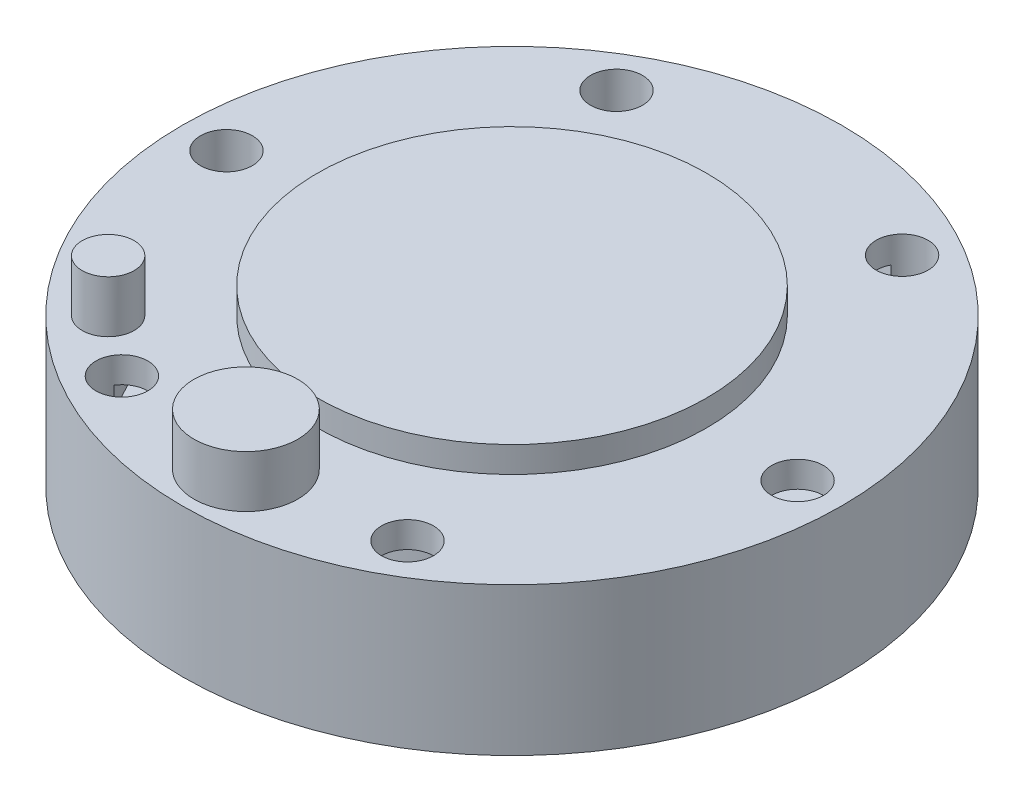
ISO-10303-21;
HEADER;
FILE_DESCRIPTION(('STEP AP214'),'2;1');
FILE_NAME('part.step','',(''),(''),'','','');
FILE_SCHEMA(('AUTOMOTIVE_DESIGN { 1 0 10303 214 1 1 1 1 }'));
ENDSEC;
DATA;
#1=APPLICATION_CONTEXT('core data for automotive mechanical design processes');
#2=APPLICATION_PROTOCOL_DEFINITION('international standard','automotive_design',2000,#1);
#3=PRODUCT_CONTEXT('',#1,'mechanical');
#4=PRODUCT('Part','Part','',(#3));
#5=PRODUCT_RELATED_PRODUCT_CATEGORY('part','',(#4));
#6=PRODUCT_DEFINITION_FORMATION('','',#4);
#7=PRODUCT_DEFINITION_CONTEXT('part definition',#1,'design');
#8=PRODUCT_DEFINITION('design','',#6,#7);
#9=PRODUCT_DEFINITION_SHAPE('','',#8);
#10=(LENGTH_UNIT() NAMED_UNIT(*) SI_UNIT(.MILLI.,.METRE.));
#11=(NAMED_UNIT(*) PLANE_ANGLE_UNIT() SI_UNIT($,.RADIAN.));
#12=(NAMED_UNIT(*) SI_UNIT($,.STERADIAN.) SOLID_ANGLE_UNIT());
#13=UNCERTAINTY_MEASURE_WITH_UNIT(LENGTH_MEASURE(1.E-05),#10,'distance_accuracy_value','');
#14=(GEOMETRIC_REPRESENTATION_CONTEXT(3) GLOBAL_UNCERTAINTY_ASSIGNED_CONTEXT((#13)) GLOBAL_UNIT_ASSIGNED_CONTEXT((#10,
#11,#12)) REPRESENTATION_CONTEXT('',''));
#15=CARTESIAN_POINT('',(0.,0.,0.));
#16=DIRECTION('',(0.,0.,1.));
#17=DIRECTION('',(1.,0.,0.));
#18=AXIS2_PLACEMENT_3D('',#15,#16,#17);
#19=CARTESIAN_POINT('',(4.80353456871138,13.0088713881503,18.9042043791199));
#20=DIRECTION('',(0.,1.,0.));
#21=DIRECTION('',(0.,0.,1.));
#22=AXIS2_PLACEMENT_3D('',#19,#20,#21);
#23=PLANE('',#22);
#24=CARTESIAN_POINT('',(4.80353456871138,13.0088713881503,18.9042043791199));
#25=DIRECTION('',(0.,1.,0.));
#26=DIRECTION('',(0.,0.,1.));
#27=AXIS2_PLACEMENT_3D('',#24,#25,#26);
#28=CIRCLE('',#27,6.9);
#29=CARTESIAN_POINT('',(4.80353456871138,13.0088713881503,25.8042043791199));
#30=VERTEX_POINT('',#29);
#31=EDGE_CURVE('E277',#30,#30,#28,.T.);
#32=ORIENTED_EDGE('',*,*,#31,.T.);
#33=EDGE_LOOP('',(#32));
#34=FACE_BOUND('',#33,.T.);
#35=CARTESIAN_POINT('',(-6.19646543128821,13.0088713881503,18.9042043791203));
#36=DIRECTION('',(0.,1.,0.));
#37=DIRECTION('',(1.,0.,0.));
#38=AXIS2_PLACEMENT_3D('',#35,#36,#37);
#39=CIRCLE('',#38,1.);
#40=CARTESIAN_POINT('',(-6.15101088583403,13.0088713881503,19.9031707871129));
#41=VERTEX_POINT('',#40);
#42=CARTESIAN_POINT('',(-6.1510108858341,13.0088713881503,17.9052379711277));
#43=VERTEX_POINT('',#42);
#44=EDGE_CURVE('E254',#41,#43,#39,.T.);
#45=ORIENTED_EDGE('',*,*,#44,.T.);
#46=CARTESIAN_POINT('',(4.80353456871138,13.0088713881503,18.9042043791199));
#47=DIRECTION('',(0.,1.,0.));
#48=DIRECTION('',(0.,0.,1.));
#49=AXIS2_PLACEMENT_3D('',#46,#47,#48);
#50=CIRCLE('',#49,11.);
#51=CARTESIAN_POINT('',(-1.53886844541015,13.0088713881503,9.91677293256847));
#52=VERTEX_POINT('',#51);
#53=EDGE_CURVE('E260',#52,#43,#50,.T.);
#54=ORIENTED_EDGE('',*,*,#53,.F.);
#55=CARTESIAN_POINT('',(-0.696465431288341,13.0088713881503,9.37792493749142));
#56=DIRECTION('',(0.,1.,0.));
#57=DIRECTION('',(0.499999999999994,0.,0.866025403784442));
#58=AXIS2_PLACEMENT_3D('',#55,#56,#57);
#59=CIRCLE('',#58,1.);
#60=CARTESIAN_POINT('',(0.191392128287609,13.0088713881503,8.9178065245759));
#61=VERTEX_POINT('',#60);
#62=EDGE_CURVE('E215',#52,#61,#59,.T.);
#63=ORIENTED_EDGE('',*,*,#62,.T.);
#64=CARTESIAN_POINT('',(9.41567700913556,13.0088713881503,8.91780652457608));
#65=VERTEX_POINT('',#64);
#66=EDGE_CURVE('E223',#65,#61,#50,.T.);
#67=ORIENTED_EDGE('',*,*,#66,.F.);
#68=CARTESIAN_POINT('',(10.3035345687117,13.0088713881503,9.37792493749127));
#69=DIRECTION('',(0.,1.,0.));
#70=DIRECTION('',(-0.500000000000025,0.,0.866025403784424));
#71=AXIS2_PLACEMENT_3D('',#68,#69,#70);
#72=CIRCLE('',#71,1.);
#73=CARTESIAN_POINT('',(11.1459375828332,13.0088713881503,9.91677293256869));
#74=VERTEX_POINT('',#73);
#75=EDGE_CURVE('E211',#65,#74,#72,.T.);
#76=ORIENTED_EDGE('',*,*,#75,.T.);
#77=CARTESIAN_POINT('',(15.7580800232569,13.0088713881503,17.9052379711276));
#78=VERTEX_POINT('',#77);
#79=EDGE_CURVE('E224',#78,#74,#50,.T.);
#80=ORIENTED_EDGE('',*,*,#79,.F.);
#81=CARTESIAN_POINT('',(15.8035345687118,13.0088713881503,18.9042043791201));
#82=DIRECTION('',(0.,1.,0.));
#83=DIRECTION('',(-1.,0.,0.));
#84=AXIS2_PLACEMENT_3D('',#81,#82,#83);
#85=CIRCLE('',#84,1.);
#86=CARTESIAN_POINT('',(15.7580800232568,13.0088713881503,19.9031707871126));
#87=VERTEX_POINT('',#86);
#88=EDGE_CURVE('E214',#78,#87,#85,.T.);
#89=ORIENTED_EDGE('',*,*,#88,.T.);
#90=CARTESIAN_POINT('',(11.1459375828332,13.0088713881503,27.8916358256712));
#91=VERTEX_POINT('',#90);
#92=EDGE_CURVE('E233',#91,#87,#50,.T.);
#93=ORIENTED_EDGE('',*,*,#92,.F.);
#94=CARTESIAN_POINT('',(10.3035345687118,13.0088713881503,28.4304838207488));
#95=DIRECTION('',(0.,1.,0.));
#96=DIRECTION('',(-0.500000000000026,0.,-0.866025403784424));
#97=AXIS2_PLACEMENT_3D('',#94,#95,#96);
#98=CIRCLE('',#97,1.);
#99=CARTESIAN_POINT('',(9.4156770091356,13.0088713881503,28.8906022336638));
#100=VERTEX_POINT('',#99);
#101=EDGE_CURVE('E159',#91,#100,#98,.T.);
#102=ORIENTED_EDGE('',*,*,#101,.T.);
#103=CARTESIAN_POINT('',(0.19139212828806,13.0088713881503,28.8906022336642));
#104=VERTEX_POINT('',#103);
#105=EDGE_CURVE('E147',#104,#100,#50,.T.);
#106=ORIENTED_EDGE('',*,*,#105,.F.);
#107=CARTESIAN_POINT('',(-0.696465431288079,13.0088713881503,28.4304838207491));
#108=DIRECTION('',(0.,1.,0.));
#109=DIRECTION('',(0.499999999999951,0.,-0.866025403784467));
#110=AXIS2_PLACEMENT_3D('',#107,#108,#109);
#111=CIRCLE('',#110,1.);
#112=CARTESIAN_POINT('',(-1.53886844540968,13.0088713881503,27.8916358256717));
#113=VERTEX_POINT('',#112);
#114=EDGE_CURVE('E145',#104,#113,#111,.T.);
#115=ORIENTED_EDGE('',*,*,#114,.T.);
#116=EDGE_CURVE('E162',#41,#113,#50,.T.);
#117=ORIENTED_EDGE('',*,*,#116,.F.);
#118=EDGE_LOOP('',(#45,#54,#63,#67,#76,#80,#89,#93,#102,#106,#115,#117));
#119=FACE_BOUND('',#118,.T.);
#120=ADVANCED_FACE('F38',(#34,#119),#23,.F.);
#121=CARTESIAN_POINT('',(4.80353456871138,9.30887138815027,18.9042043791199));
#122=DIRECTION('',(0.,1.,0.));
#123=DIRECTION('',(0.,0.,1.));
#124=AXIS2_PLACEMENT_3D('',#121,#122,#123);
#125=PLANE('',#124);
#126=CARTESIAN_POINT('',(4.80353456871138,9.30887138815027,18.9042043791199));
#127=DIRECTION('',(0.,1.,0.));
#128=DIRECTION('',(0.,0.,1.));
#129=AXIS2_PLACEMENT_3D('',#126,#127,#128);
#130=CIRCLE('',#129,6.9);
#131=CARTESIAN_POINT('',(4.80353456871138,9.30887138815027,25.8042043791199));
#132=VERTEX_POINT('',#131);
#133=EDGE_CURVE('E266',#132,#132,#130,.T.);
#134=ORIENTED_EDGE('',*,*,#133,.F.);
#135=EDGE_LOOP('',(#134));
#136=FACE_BOUND('',#135,.T.);
#137=CARTESIAN_POINT('',(4.80353456871138,9.30887138815027,18.9042043791199));
#138=DIRECTION('',(0.,1.,0.));
#139=DIRECTION('',(0.,0.,1.));
#140=AXIS2_PLACEMENT_3D('',#137,#138,#139);
#141=CIRCLE('',#140,11.);
#142=CARTESIAN_POINT('',(-6.15101088583363,9.30887138815028,19.9031707871129));
#143=VERTEX_POINT('',#142);
#144=CARTESIAN_POINT('',(-1.53886844540968,9.30887138815027,27.8916358256717));
#145=VERTEX_POINT('',#144);
#146=EDGE_CURVE('E137',#143,#145,#141,.T.);
#147=ORIENTED_EDGE('',*,*,#146,.T.);
#148=CARTESIAN_POINT('',(-0.696465431288081,9.30887138815027,28.4304838207491));
#149=DIRECTION('',(0.,-1.,0.));
#150=DIRECTION('',(-0.499999999999951,0.,0.866025403784467));
#151=AXIS2_PLACEMENT_3D('',#148,#149,#150);
#152=CIRCLE('',#151,1.00000000000001);
#153=CARTESIAN_POINT('',(0.191392128288061,9.30887138815027,28.8906022336642));
#154=VERTEX_POINT('',#153);
#155=EDGE_CURVE('E134',#145,#154,#152,.T.);
#156=ORIENTED_EDGE('',*,*,#155,.T.);
#157=CARTESIAN_POINT('',(9.4156770091356,9.30887138815027,28.8906022336638));
#158=VERTEX_POINT('',#157);
#159=EDGE_CURVE('E123',#154,#158,#141,.T.);
#160=ORIENTED_EDGE('',*,*,#159,.T.);
#161=CARTESIAN_POINT('',(10.3035345687118,9.30887138815027,28.4304838207488));
#162=DIRECTION('',(0.,-1.,0.));
#163=DIRECTION('',(0.500000000000026,0.,0.866025403784424));
#164=AXIS2_PLACEMENT_3D('',#161,#162,#163);
#165=CIRCLE('',#164,1.00000000000001);
#166=CARTESIAN_POINT('',(11.1459375828334,9.30887138815027,27.8916358256714));
#167=VERTEX_POINT('',#166);
#168=EDGE_CURVE('E133',#158,#167,#165,.T.);
#169=ORIENTED_EDGE('',*,*,#168,.T.);
#170=CARTESIAN_POINT('',(15.7580800232568,9.30887138815027,19.9031707871126));
#171=VERTEX_POINT('',#170);
#172=EDGE_CURVE('E136',#167,#171,#141,.T.);
#173=ORIENTED_EDGE('',*,*,#172,.T.);
#174=CARTESIAN_POINT('',(15.8035345687118,9.30887138815027,18.9042043791201));
#175=DIRECTION('',(0.,-1.,0.));
#176=DIRECTION('',(1.,0.,0.));
#177=AXIS2_PLACEMENT_3D('',#174,#175,#176);
#178=CIRCLE('',#177,1.00000000000001);
#179=CARTESIAN_POINT('',(15.7580800232573,9.30887138815027,17.9052379711276));
#180=VERTEX_POINT('',#179);
#181=EDGE_CURVE('E238',#171,#180,#178,.T.);
#182=ORIENTED_EDGE('',*,*,#181,.T.);
#183=CARTESIAN_POINT('',(11.1459375828332,9.30887138815027,9.91677293256869));
#184=VERTEX_POINT('',#183);
#185=EDGE_CURVE('E210',#180,#184,#141,.T.);
#186=ORIENTED_EDGE('',*,*,#185,.T.);
#187=CARTESIAN_POINT('',(10.3035345687117,9.30887138815027,9.37792493749127));
#188=DIRECTION('',(0.,-1.,0.));
#189=DIRECTION('',(0.500000000000025,0.,-0.866025403784424));
#190=AXIS2_PLACEMENT_3D('',#187,#188,#189);
#191=CIRCLE('',#190,1.00000000000001);
#192=CARTESIAN_POINT('',(9.41567700913556,9.30887138815027,8.91780652457608));
#193=VERTEX_POINT('',#192);
#194=EDGE_CURVE('E206',#184,#193,#191,.T.);
#195=ORIENTED_EDGE('',*,*,#194,.T.);
#196=CARTESIAN_POINT('',(0.191392128287608,9.30887138815027,8.9178065245759));
#197=VERTEX_POINT('',#196);
#198=EDGE_CURVE('E209',#193,#197,#141,.T.);
#199=ORIENTED_EDGE('',*,*,#198,.T.);
#200=CARTESIAN_POINT('',(-0.696465431288343,9.30887138815027,9.37792493749142));
#201=DIRECTION('',(0.,-1.,0.));
#202=DIRECTION('',(-0.499999999999994,0.,-0.866025403784442));
#203=AXIS2_PLACEMENT_3D('',#200,#201,#202);
#204=CIRCLE('',#203,1.00000000000001);
#205=CARTESIAN_POINT('',(-1.53886844540992,9.30887138815028,9.91677293256881));
#206=VERTEX_POINT('',#205);
#207=EDGE_CURVE('E249',#197,#206,#204,.T.);
#208=ORIENTED_EDGE('',*,*,#207,.T.);
#209=CARTESIAN_POINT('',(-6.1510108858341,9.30887138815027,17.9052379711278));
#210=VERTEX_POINT('',#209);
#211=EDGE_CURVE('E153',#206,#210,#141,.T.);
#212=ORIENTED_EDGE('',*,*,#211,.T.);
#213=CARTESIAN_POINT('',(-6.19646543128821,9.30887138815028,18.9042043791203));
#214=DIRECTION('',(0.,-1.,0.));
#215=DIRECTION('',(-1.,0.,0.));
#216=AXIS2_PLACEMENT_3D('',#213,#214,#215);
#217=CIRCLE('',#216,1.00000000000001);
#218=EDGE_CURVE('E54',#210,#143,#217,.T.);
#219=ORIENTED_EDGE('',*,*,#218,.T.);
#220=EDGE_LOOP('',(#147,#156,#160,#169,#173,#182,#186,#195,#199,#208,#212,#219));
#221=FACE_BOUND('',#220,.T.);
#222=ADVANCED_FACE('F150',(#136,#221),#125,.T.);
#223=CARTESIAN_POINT('',(4.80353456871138,13.0088713881503,18.9042043791199));
#224=DIRECTION('',(0.,-1.,0.));
#225=DIRECTION('',(0.,0.,-1.));
#226=AXIS2_PLACEMENT_3D('',#223,#224,#225);
#227=CYLINDRICAL_SURFACE('',#226,11.);
#228=ORIENTED_EDGE('',*,*,#116,.T.);
#229=DIRECTION('',(0.,1.,0.));
#230=VECTOR('',#229,1.);
#231=CARTESIAN_POINT('',(-1.53886844540967,11.1588713881503,27.8916358256717));
#232=LINE('',#231,#230);
#233=EDGE_CURVE('E160',#113,#145,#232,.F.);
#234=ORIENTED_EDGE('',*,*,#233,.T.);
#235=ORIENTED_EDGE('',*,*,#146,.F.);
#236=DIRECTION('',(0.,1.,0.));
#237=VECTOR('',#236,1.);
#238=CARTESIAN_POINT('',(-6.15101088583363,11.1588713881503,19.9031707871129));
#239=LINE('',#238,#237);
#240=EDGE_CURVE('E161',#143,#41,#239,.T.);
#241=ORIENTED_EDGE('',*,*,#240,.T.);
#242=EDGE_LOOP('',(#228,#234,#235,#241));
#243=FACE_BOUND('',#242,.T.);
#244=ADVANCED_FACE('F365',(#243),#227,.F.);
#245=ORIENTED_EDGE('',*,*,#211,.F.);
#246=DIRECTION('',(0.,1.,0.));
#247=VECTOR('',#246,1.);
#248=CARTESIAN_POINT('',(-1.5388684454099,11.1588713881503,9.9167729325688));
#249=LINE('',#248,#247);
#250=EDGE_CURVE('E257',#206,#52,#249,.T.);
#251=ORIENTED_EDGE('',*,*,#250,.T.);
#252=ORIENTED_EDGE('',*,*,#53,.T.);
#253=DIRECTION('',(0.,1.,0.));
#254=VECTOR('',#253,1.);
#255=CARTESIAN_POINT('',(-6.1510108858337,11.1588713881503,17.9052379711278));
#256=LINE('',#255,#254);
#257=EDGE_CURVE('E271',#43,#210,#256,.F.);
#258=ORIENTED_EDGE('',*,*,#257,.T.);
#259=EDGE_LOOP('',(#245,#251,#252,#258));
#260=FACE_BOUND('',#259,.T.);
#261=ADVANCED_FACE('F385',(#260),#227,.F.);
#262=CARTESIAN_POINT('',(4.80353456871138,15.0088713881503,18.9042043791199));
#263=DIRECTION('',(0.,1.,0.));
#264=DIRECTION('',(0.,0.,-1.));
#265=AXIS2_PLACEMENT_3D('',#262,#263,#264);
#266=PLANE('',#265);
#267=CARTESIAN_POINT('',(4.80353456871226,15.0088713881503,18.9042043791205));
#268=DIRECTION('',(0.,1.,0.));
#269=DIRECTION('',(0.500000000000031,0.,-0.86602540378442));
#270=AXIS2_PLACEMENT_3D('',#267,#268,#269);
#271=CIRCLE('',#270,7.5);
#272=CARTESIAN_POINT('',(8.55353456871249,15.0088713881503,12.4090138507374));
#273=VERTEX_POINT('',#272);
#274=EDGE_CURVE('E148',#273,#273,#271,.T.);
#275=ORIENTED_EDGE('',*,*,#274,.T.);
#276=EDGE_LOOP('',(#275));
#277=FACE_BOUND('',#276,.T.);
#278=ADVANCED_FACE('F383',(#277),#266,.T.);
#279=DIRECTION('',(0.,1.,0.));
#280=VECTOR('',#279,1.);
#281=CARTESIAN_POINT('',(0.191392128288049,11.1588713881503,28.8906022336642));
#282=LINE('',#281,#280);
#283=EDGE_CURVE('E126',#154,#104,#282,.T.);
#284=ORIENTED_EDGE('',*,*,#283,.T.);
#285=ORIENTED_EDGE('',*,*,#105,.T.);
#286=DIRECTION('',(0.,1.,0.));
#287=VECTOR('',#286,1.);
#288=CARTESIAN_POINT('',(9.41567700913571,11.1588713881503,28.890602233664));
#289=LINE('',#288,#287);
#290=EDGE_CURVE('E128',#100,#158,#289,.F.);
#291=ORIENTED_EDGE('',*,*,#290,.T.);
#292=ORIENTED_EDGE('',*,*,#159,.F.);
#293=EDGE_LOOP('',(#284,#285,#291,#292));
#294=FACE_BOUND('',#293,.T.);
#295=ADVANCED_FACE('F125',(#294),#227,.F.);
#296=CARTESIAN_POINT('',(15.8035345687118,41.9372985128965,18.9042043791201));
#297=DIRECTION('',(0.,-1.,0.));
#298=DIRECTION('',(1.,0.,0.));
#299=AXIS2_PLACEMENT_3D('',#296,#297,#298);
#300=CYLINDRICAL_SURFACE('',#299,1.);
#301=DIRECTION('',(0.,1.,0.));
#302=VECTOR('',#301,1.);
#303=CARTESIAN_POINT('',(15.7580800232573,11.1588713881503,19.9031707871126));
#304=LINE('',#303,#302);
#305=EDGE_CURVE('E243',#87,#171,#304,.F.);
#306=ORIENTED_EDGE('',*,*,#305,.F.);
#307=ORIENTED_EDGE('',*,*,#88,.F.);
#308=DIRECTION('',(0.,1.,0.));
#309=VECTOR('',#308,1.);
#310=CARTESIAN_POINT('',(15.7580800232573,11.1588713881503,17.9052379711276));
#311=LINE('',#310,#309);
#312=EDGE_CURVE('E219',#180,#78,#311,.T.);
#313=ORIENTED_EDGE('',*,*,#312,.F.);
#314=ORIENTED_EDGE('',*,*,#181,.F.);
#315=EDGE_LOOP('',(#306,#307,#313,#314));
#316=FACE_BOUND('',#315,.T.);
#317=CARTESIAN_POINT('',(15.8035345687118,8.30887138815027,18.9042043791201));
#318=DIRECTION('',(0.,1.,0.));
#319=DIRECTION('',(-0.500000000000025,0.,0.866025403784424));
#320=AXIS2_PLACEMENT_3D('',#317,#318,#319);
#321=CIRCLE('',#320,1.00000000000019);
#322=CARTESIAN_POINT('',(15.3035345687117,8.30887138815027,19.7702297829047));
#323=VERTEX_POINT('',#322);
#324=EDGE_CURVE('E171',#323,#323,#321,.T.);
#325=ORIENTED_EDGE('',*,*,#324,.F.);
#326=EDGE_LOOP('',(#325));
#327=FACE_BOUND('',#326,.T.);
#328=CARTESIAN_POINT('',(15.8035345687118,14.0088713881503,18.9042043791201));
#329=DIRECTION('',(0.,1.,0.));
#330=DIRECTION('',(-1.,0.,0.));
#331=AXIS2_PLACEMENT_3D('',#328,#329,#330);
#332=CIRCLE('',#331,1.);
#333=CARTESIAN_POINT('',(14.8035345687118,14.0088713881503,18.9042043791201));
#334=VERTEX_POINT('',#333);
#335=EDGE_CURVE('E229',#334,#334,#332,.T.);
#336=ORIENTED_EDGE('',*,*,#335,.T.);
#337=EDGE_LOOP('',(#336));
#338=FACE_BOUND('',#337,.T.);
#339=ADVANCED_FACE('F344',(#316,#327,#338),#300,.F.);
#340=CARTESIAN_POINT('',(-0.696465431288333,41.9372985128965,9.37792493749142));
#341=DIRECTION('',(0.,-1.,0.));
#342=DIRECTION('',(-0.499999999999994,0.,-0.866025403784442));
#343=AXIS2_PLACEMENT_3D('',#340,#341,#342);
#344=CYLINDRICAL_SURFACE('',#343,1.);
#345=DIRECTION('',(0.,1.,0.));
#346=VECTOR('',#345,1.);
#347=CARTESIAN_POINT('',(0.191392128287765,11.1588713881503,8.91780652457627));
#348=LINE('',#347,#346);
#349=EDGE_CURVE('E234',#61,#197,#348,.F.);
#350=ORIENTED_EDGE('',*,*,#349,.F.);
#351=ORIENTED_EDGE('',*,*,#62,.F.);
#352=ORIENTED_EDGE('',*,*,#250,.F.);
#353=ORIENTED_EDGE('',*,*,#207,.F.);
#354=EDGE_LOOP('',(#350,#351,#352,#353));
#355=FACE_BOUND('',#354,.T.);
#356=CARTESIAN_POINT('',(-0.696465431288349,8.30887138815027,9.37792493749142));
#357=DIRECTION('',(0.,1.,0.));
#358=DIRECTION('',(-0.500000000000025,0.,0.866025403784424));
#359=AXIS2_PLACEMENT_3D('',#356,#357,#358);
#360=CIRCLE('',#359,1.00000000000047);
#361=CARTESIAN_POINT('',(-1.19646543128861,8.30887138815027,10.2439503412763));
#362=VERTEX_POINT('',#361);
#363=EDGE_CURVE('E167',#362,#362,#360,.T.);
#364=ORIENTED_EDGE('',*,*,#363,.F.);
#365=EDGE_LOOP('',(#364));
#366=FACE_BOUND('',#365,.T.);
#367=CARTESIAN_POINT('',(-0.696465431288342,14.0088713881503,9.37792493749142));
#368=DIRECTION('',(0.,1.,0.));
#369=DIRECTION('',(-1.,0.,0.));
#370=AXIS2_PLACEMENT_3D('',#367,#368,#369);
#371=CIRCLE('',#370,1.);
#372=CARTESIAN_POINT('',(-1.69646543128834,14.0088713881503,9.37792493749142));
#373=VERTEX_POINT('',#372);
#374=EDGE_CURVE('E205',#373,#373,#371,.T.);
#375=ORIENTED_EDGE('',*,*,#374,.T.);
#376=EDGE_LOOP('',(#375));
#377=FACE_BOUND('',#376,.T.);
#378=ADVANCED_FACE('F341',(#355,#366,#377),#344,.F.);
#379=CARTESIAN_POINT('',(4.80353456871138,15.0088713881503,18.9042043791199));
#380=DIRECTION('',(0.,-1.,0.));
#381=DIRECTION('',(-1.,0.,0.));
#382=AXIS2_PLACEMENT_3D('',#379,#380,#381);
#383=CYLINDRICAL_SURFACE('',#382,12.7);
#384=CARTESIAN_POINT('',(4.80353456871138,8.30887138815027,18.9042043791199));
#385=DIRECTION('',(0.,1.,0.));
#386=DIRECTION('',(-0.500000000000025,0.,0.866025403784424));
#387=AXIS2_PLACEMENT_3D('',#384,#385,#386);
#388=CIRCLE('',#387,12.7);
#389=CARTESIAN_POINT('',(-7.89646543128862,8.30887138815027,18.9042043791196));
#390=VERTEX_POINT('',#389);
#391=EDGE_CURVE('E201',#390,#390,#388,.T.);
#392=CARTESIAN_POINT('',(4.80353456871226,14.0088713881503,18.9042043791205));
#393=DIRECTION('',(0.,1.,0.));
#394=DIRECTION('',(0.500000000000031,0.,-0.86602540378442));
#395=AXIS2_PLACEMENT_3D('',#392,#393,#394);
#396=CIRCLE('',#395,12.7);
#397=CARTESIAN_POINT('',(-7.89646543128862,14.0088713881503,18.9042043791196));
#398=VERTEX_POINT('',#397);
#399=EDGE_CURVE('E181',#398,#398,#396,.T.);
#400=CARTESIAN_POINT('',(-7.89646543128862,8.30887138815027,18.9042043791196));
#401=CARTESIAN_POINT('',(-7.89646543128862,8.36824638815028,18.9042043791196));
#402=CARTESIAN_POINT('',(-7.89646543128862,8.42762138815027,18.9042043791196));
#403=CARTESIAN_POINT('',(-7.89646543128862,8.54637138815028,18.9042043791196));
#404=CARTESIAN_POINT('',(-7.89646543128862,8.60574638815027,18.9042043791196));
#405=CARTESIAN_POINT('',(-7.89646543128862,8.72449638815028,18.9042043791196));
#406=CARTESIAN_POINT('',(-7.89646543128862,8.78387138815027,18.9042043791196));
#407=CARTESIAN_POINT('',(-7.89646543128862,8.90262138815027,18.9042043791196));
#408=CARTESIAN_POINT('',(-7.89646543128862,8.96199638815028,18.9042043791196));
#409=CARTESIAN_POINT('',(-7.89646543128862,9.08074638815028,18.9042043791196));
#410=CARTESIAN_POINT('',(-7.89646543128862,9.14012138815028,18.9042043791196));
#411=CARTESIAN_POINT('',(-7.89646543128862,9.25887138815028,18.9042043791196));
#412=CARTESIAN_POINT('',(-7.89646543128862,9.31824638815027,18.9042043791196));
#413=CARTESIAN_POINT('',(-7.89646543128862,9.43699638815028,18.9042043791196));
#414=CARTESIAN_POINT('',(-7.89646543128862,9.49637138815028,18.9042043791196));
#415=CARTESIAN_POINT('',(-7.89646543128862,9.61512138815027,18.9042043791196));
#416=CARTESIAN_POINT('',(-7.89646543128862,9.67449638815028,18.9042043791196));
#417=CARTESIAN_POINT('',(-7.89646543128862,9.79324638815027,18.9042043791196));
#418=CARTESIAN_POINT('',(-7.89646543128862,9.85262138815028,18.9042043791196));
#419=CARTESIAN_POINT('',(-7.89646543128862,9.97137138815028,18.9042043791196));
#420=CARTESIAN_POINT('',(-7.89646543128862,10.0307463881503,18.9042043791196));
#421=CARTESIAN_POINT('',(-7.89646543128862,10.1494963881503,18.9042043791196));
#422=CARTESIAN_POINT('',(-7.89646543128862,10.2088713881503,18.9042043791196));
#423=CARTESIAN_POINT('',(-7.89646543128862,10.3276213881503,18.9042043791196));
#424=CARTESIAN_POINT('',(-7.89646543128862,10.3869963881503,18.9042043791196));
#425=CARTESIAN_POINT('',(-7.89646543128862,10.5057463881503,18.9042043791196));
#426=CARTESIAN_POINT('',(-7.89646543128862,10.5651213881503,18.9042043791196));
#427=CARTESIAN_POINT('',(-7.89646543128862,10.6838713881503,18.9042043791196));
#428=CARTESIAN_POINT('',(-7.89646543128862,10.7432463881503,18.9042043791196));
#429=CARTESIAN_POINT('',(-7.89646543128862,10.8619963881503,18.9042043791196));
#430=CARTESIAN_POINT('',(-7.89646543128862,10.9213713881503,18.9042043791196));
#431=CARTESIAN_POINT('',(-7.89646543128862,11.0401213881503,18.9042043791196));
#432=CARTESIAN_POINT('',(-7.89646543128862,11.0994963881503,18.9042043791196));
#433=CARTESIAN_POINT('',(-7.89646543128862,11.2182463881503,18.9042043791196));
#434=CARTESIAN_POINT('',(-7.89646543128862,11.2776213881503,18.9042043791196));
#435=CARTESIAN_POINT('',(-7.89646543128862,11.3963713881503,18.9042043791196));
#436=CARTESIAN_POINT('',(-7.89646543128862,11.4557463881503,18.9042043791196));
#437=CARTESIAN_POINT('',(-7.89646543128862,11.5744963881503,18.9042043791196));
#438=CARTESIAN_POINT('',(-7.89646543128862,11.6338713881503,18.9042043791196));
#439=CARTESIAN_POINT('',(-7.89646543128862,11.7526213881503,18.9042043791196));
#440=CARTESIAN_POINT('',(-7.89646543128862,11.8119963881503,18.9042043791196));
#441=CARTESIAN_POINT('',(-7.89646543128862,11.9307463881503,18.9042043791196));
#442=CARTESIAN_POINT('',(-7.89646543128862,11.9901213881503,18.9042043791196));
#443=CARTESIAN_POINT('',(-7.89646543128862,12.1088713881503,18.9042043791196));
#444=CARTESIAN_POINT('',(-7.89646543128862,12.1682463881503,18.9042043791196));
#445=CARTESIAN_POINT('',(-7.89646543128862,12.2869963881503,18.9042043791196));
#446=CARTESIAN_POINT('',(-7.89646543128862,12.3463713881503,18.9042043791196));
#447=CARTESIAN_POINT('',(-7.89646543128862,12.4651213881503,18.9042043791196));
#448=CARTESIAN_POINT('',(-7.89646543128862,12.5244963881503,18.9042043791196));
#449=CARTESIAN_POINT('',(-7.89646543128862,12.6432463881503,18.9042043791196));
#450=CARTESIAN_POINT('',(-7.89646543128862,12.7026213881503,18.9042043791196));
#451=CARTESIAN_POINT('',(-7.89646543128862,12.8213713881503,18.9042043791196));
#452=CARTESIAN_POINT('',(-7.89646543128862,12.8807463881503,18.9042043791196));
#453=CARTESIAN_POINT('',(-7.89646543128862,12.9994963881503,18.9042043791196));
#454=CARTESIAN_POINT('',(-7.89646543128862,13.0588713881503,18.9042043791196));
#455=CARTESIAN_POINT('',(-7.89646543128862,13.1776213881503,18.9042043791196));
#456=CARTESIAN_POINT('',(-7.89646543128862,13.2369963881503,18.9042043791196));
#457=CARTESIAN_POINT('',(-7.89646543128862,13.3557463881503,18.9042043791196));
#458=CARTESIAN_POINT('',(-7.89646543128862,13.4151213881503,18.9042043791196));
#459=CARTESIAN_POINT('',(-7.89646543128862,13.5338713881503,18.9042043791196));
#460=CARTESIAN_POINT('',(-7.89646543128862,13.5932463881503,18.9042043791196));
#461=CARTESIAN_POINT('',(-7.89646543128862,13.7119963881503,18.9042043791196));
#462=CARTESIAN_POINT('',(-7.89646543128862,13.7713713881503,18.9042043791196));
#463=CARTESIAN_POINT('',(-7.89646543128862,13.8901213881503,18.9042043791196));
#464=CARTESIAN_POINT('',(-7.89646543128862,13.9494963881503,18.9042043791196));
#465=CARTESIAN_POINT('',(-7.89646543128862,14.0088713881503,18.9042043791196));
#466=B_SPLINE_CURVE_WITH_KNOTS('',3,(#400,#401,#402,#403,#404,#405,#406,#407,#408,#409,#410,
#411,#412,#413,#414,#415,#416,#417,#418,#419,#420,#421,#422,#423,#424,#425,#426,#427,#428,#429,
#430,#431,#432,#433,#434,#435,#436,#437,#438,#439,#440,#441,#442,#443,#444,#445,#446,#447,#448,
#449,#450,#451,#452,#453,#454,#455,#456,#457,#458,#459,#460,#461,#462,#463,#464,#465),
.UNSPECIFIED.,.F.,.F.,(4,2,2,2,2,2,2,2,2,2,2,2,2,2,2,2,2,2,2,2,2,2,2,2,2,2,2,2,2,2,2,2,4),(0.,
0.178125000000001,0.356250000000001,0.534375,0.712500000000001,0.890625000000001,1.06875,
1.246875,1.425,1.603125,1.78125,1.959375,2.1375,2.315625,2.49375,2.671875,2.85,3.028125,3.20625,
3.384375,3.5625,3.740625,3.91875,4.096875,4.275,4.453125,4.63125,4.809375,4.9875,5.165625,
5.34375,5.521875,5.7),.UNSPECIFIED.);
#467=EDGE_CURVE('BSEAM343',#390,#398,#466,.T.);
#468=ORIENTED_EDGE('',*,*,#391,.T.);
#469=ORIENTED_EDGE('',*,*,#399,.F.);
#470=ORIENTED_EDGE('',*,*,#467,.T.);
#471=ORIENTED_EDGE('',*,*,#467,.F.);
#472=EDGE_LOOP('',(#468,#470,#469,#471));
#473=FACE_BOUND('',#472,.T.);
#474=ADVANCED_FACE('F343',(#473),#383,.T.);
#475=CARTESIAN_POINT('',(4.80353456871138,7.30887138815027,18.9042043791199));
#476=DIRECTION('',(0.,-1.,0.));
#477=DIRECTION('',(0.,0.,1.));
#478=AXIS2_PLACEMENT_3D('',#475,#476,#477);
#479=PLANE('',#478);
#480=CARTESIAN_POINT('',(4.80353456871138,7.30887138815027,18.9042043791199));
#481=DIRECTION('',(0.,1.,0.));
#482=DIRECTION('',(-0.500000000000025,0.,0.866025403784424));
#483=AXIS2_PLACEMENT_3D('',#480,#481,#482);
#484=CIRCLE('',#483,7.5);
#485=CARTESIAN_POINT('',(1.05353456871119,7.30887138815027,25.3993949075031));
#486=VERTEX_POINT('',#485);
#487=EDGE_CURVE('E188',#486,#486,#484,.T.);
#488=ORIENTED_EDGE('',*,*,#487,.F.);
#489=EDGE_LOOP('',(#488));
#490=FACE_BOUND('',#489,.T.);
#491=ADVANCED_FACE('F351',(#490),#479,.T.);
#492=CARTESIAN_POINT('',(10.3035345687117,41.9372985128965,9.37792493749127));
#493=DIRECTION('',(0.,-1.,0.));
#494=DIRECTION('',(0.500000000000025,0.,-0.866025403784424));
#495=AXIS2_PLACEMENT_3D('',#492,#493,#494);
#496=CYLINDRICAL_SURFACE('',#495,1.);
#497=DIRECTION('',(0.,1.,0.));
#498=VECTOR('',#497,1.);
#499=CARTESIAN_POINT('',(11.1459375828332,11.1588713881503,9.91677293256868));
#500=LINE('',#499,#498);
#501=EDGE_CURVE('E216',#74,#184,#500,.F.);
#502=ORIENTED_EDGE('',*,*,#501,.F.);
#503=ORIENTED_EDGE('',*,*,#75,.F.);
#504=DIRECTION('',(0.,1.,0.));
#505=VECTOR('',#504,1.);
#506=CARTESIAN_POINT('',(9.41567700913557,11.1588713881503,8.91780652457609));
#507=LINE('',#506,#505);
#508=EDGE_CURVE('E220',#193,#65,#507,.T.);
#509=ORIENTED_EDGE('',*,*,#508,.F.);
#510=ORIENTED_EDGE('',*,*,#194,.F.);
#511=EDGE_LOOP('',(#502,#503,#509,#510));
#512=FACE_BOUND('',#511,.T.);
#513=CARTESIAN_POINT('',(10.3035345687117,8.30887138815027,9.37792493749127));
#514=DIRECTION('',(0.,1.,0.));
#515=DIRECTION('',(-0.500000000000025,0.,0.866025403784424));
#516=AXIS2_PLACEMENT_3D('',#513,#514,#515);
#517=CIRCLE('',#516,1.);
#518=CARTESIAN_POINT('',(9.80353456871163,8.30887138815027,10.2439503412757));
#519=VERTEX_POINT('',#518);
#520=EDGE_CURVE('E174',#519,#519,#517,.T.);
#521=ORIENTED_EDGE('',*,*,#520,.F.);
#522=EDGE_LOOP('',(#521));
#523=FACE_BOUND('',#522,.T.);
#524=CARTESIAN_POINT('',(10.3035345687117,14.0088713881503,9.37792493749127));
#525=DIRECTION('',(0.,1.,0.));
#526=DIRECTION('',(-1.,0.,0.));
#527=AXIS2_PLACEMENT_3D('',#524,#525,#526);
#528=CIRCLE('',#527,1.);
#529=CARTESIAN_POINT('',(9.30353456871166,14.0088713881503,9.37792493749127));
#530=VERTEX_POINT('',#529);
#531=EDGE_CURVE('E204',#530,#530,#528,.T.);
#532=ORIENTED_EDGE('',*,*,#531,.T.);
#533=EDGE_LOOP('',(#532));
#534=FACE_BOUND('',#533,.T.);
#535=ADVANCED_FACE('F376',(#512,#523,#534),#496,.F.);
#536=ORIENTED_EDGE('',*,*,#501,.T.);
#537=ORIENTED_EDGE('',*,*,#185,.F.);
#538=ORIENTED_EDGE('',*,*,#312,.T.);
#539=ORIENTED_EDGE('',*,*,#79,.T.);
#540=EDGE_LOOP('',(#536,#537,#538,#539));
#541=FACE_BOUND('',#540,.T.);
#542=ADVANCED_FACE('F373',(#541),#227,.F.);
#543=ORIENTED_EDGE('',*,*,#508,.T.);
#544=ORIENTED_EDGE('',*,*,#66,.T.);
#545=ORIENTED_EDGE('',*,*,#349,.T.);
#546=ORIENTED_EDGE('',*,*,#198,.F.);
#547=EDGE_LOOP('',(#543,#544,#545,#546));
#548=FACE_BOUND('',#547,.T.);
#549=ADVANCED_FACE('F375',(#548),#227,.F.);
#550=DIRECTION('',(0.,1.,0.));
#551=VECTOR('',#550,1.);
#552=CARTESIAN_POINT('',(11.1459375828333,11.1588713881503,27.8916358256714));
#553=LINE('',#552,#551);
#554=EDGE_CURVE('E230',#167,#91,#553,.T.);
#555=ORIENTED_EDGE('',*,*,#554,.T.);
#556=ORIENTED_EDGE('',*,*,#92,.T.);
#557=ORIENTED_EDGE('',*,*,#305,.T.);
#558=ORIENTED_EDGE('',*,*,#172,.F.);
#559=EDGE_LOOP('',(#555,#556,#557,#558));
#560=FACE_BOUND('',#559,.T.);
#561=ADVANCED_FACE('F378',(#560),#227,.F.);
#562=CARTESIAN_POINT('',(-2.97464002434063,15.0088713881503,26.682378972172));
#563=DIRECTION('',(0.,1.,0.));
#564=DIRECTION('',(0.,0.,-1.));
#565=AXIS2_PLACEMENT_3D('',#562,#563,#564);
#566=CYLINDRICAL_SURFACE('',#565,1.00000000000001);
#567=CARTESIAN_POINT('',(-2.97464002434063,16.0088713881503,26.682378972172));
#568=DIRECTION('',(0.,-1.,0.));
#569=DIRECTION('',(1.,0.,0.));
#570=AXIS2_PLACEMENT_3D('',#567,#568,#569);
#571=CIRCLE('',#570,1.00000000000001);
#572=CARTESIAN_POINT('',(-1.97464002434062,16.0088713881503,26.682378972172));
#573=VERTEX_POINT('',#572);
#574=EDGE_CURVE('E11',#573,#573,#571,.F.);
#575=ORIENTED_EDGE('',*,*,#574,.F.);
#576=EDGE_LOOP('',(#575));
#577=FACE_BOUND('',#576,.T.);
#578=CARTESIAN_POINT('',(-2.97464002434006,14.0088713881503,26.6823789721723));
#579=DIRECTION('',(0.,1.,0.));
#580=DIRECTION('',(0.500000000000031,0.,-0.86602540378442));
#581=AXIS2_PLACEMENT_3D('',#578,#579,#580);
#582=CIRCLE('',#581,1.);
#583=CARTESIAN_POINT('',(-2.47464002434003,14.0088713881503,25.8163535683878));
#584=VERTEX_POINT('',#583);
#585=EDGE_CURVE('E246',#584,#584,#582,.T.);
#586=ORIENTED_EDGE('',*,*,#585,.T.);
#587=EDGE_LOOP('',(#586));
#588=FACE_BOUND('',#587,.T.);
#589=ADVANCED_FACE('F317',(#577,#588),#566,.T.);
#590=CARTESIAN_POINT('',(4.80353456871138,15.0088713881503,29.1542043791199));
#591=DIRECTION('',(0.,1.,0.));
#592=DIRECTION('',(0.,0.,-1.));
#593=AXIS2_PLACEMENT_3D('',#590,#591,#592);
#594=CYLINDRICAL_SURFACE('',#593,2.);
#595=CARTESIAN_POINT('',(4.80353456871138,16.0088713881503,29.1542043791199));
#596=DIRECTION('',(0.,-1.,0.));
#597=DIRECTION('',(1.,0.,0.));
#598=AXIS2_PLACEMENT_3D('',#595,#596,#597);
#599=CIRCLE('',#598,2.);
#600=CARTESIAN_POINT('',(6.80353456871138,16.0088713881503,29.1542043791199));
#601=VERTEX_POINT('',#600);
#602=EDGE_CURVE('E42',#601,#601,#599,.F.);
#603=ORIENTED_EDGE('',*,*,#602,.F.);
#604=EDGE_LOOP('',(#603));
#605=FACE_BOUND('',#604,.T.);
#606=CARTESIAN_POINT('',(4.80353456871189,14.0088713881503,29.1542043791205));
#607=DIRECTION('',(0.,1.,0.));
#608=DIRECTION('',(0.500000000000031,0.,-0.86602540378442));
#609=AXIS2_PLACEMENT_3D('',#606,#607,#608);
#610=CIRCLE('',#609,2.);
#611=CARTESIAN_POINT('',(5.80353456871195,14.0088713881503,27.4221535715517));
#612=VERTEX_POINT('',#611);
#613=EDGE_CURVE('E263',#612,#612,#610,.T.);
#614=ORIENTED_EDGE('',*,*,#613,.T.);
#615=EDGE_LOOP('',(#614));
#616=FACE_BOUND('',#615,.T.);
#617=ADVANCED_FACE('F313',(#605,#616),#594,.T.);
#618=CARTESIAN_POINT('',(4.80353456871138,9.30887138815027,18.9042043791199));
#619=DIRECTION('',(0.,1.,0.));
#620=DIRECTION('',(0.,0.,1.));
#621=AXIS2_PLACEMENT_3D('',#618,#619,#620);
#622=CYLINDRICAL_SURFACE('',#621,6.9);
#623=ORIENTED_EDGE('',*,*,#133,.T.);
#624=EDGE_LOOP('',(#623));
#625=FACE_BOUND('',#624,.T.);
#626=CARTESIAN_POINT('',(4.80353456871138,11.0588713881503,18.9042043791199));
#627=DIRECTION('',(0.,1.,0.));
#628=DIRECTION('',(0.,0.,1.));
#629=AXIS2_PLACEMENT_3D('',#626,#627,#628);
#630=CIRCLE('',#629,6.9);
#631=CARTESIAN_POINT('',(4.80353456871138,11.0588713881503,25.8042043791199));
#632=VERTEX_POINT('',#631);
#633=EDGE_CURVE('E276',#632,#632,#630,.F.);
#634=ORIENTED_EDGE('',*,*,#633,.T.);
#635=EDGE_LOOP('',(#634));
#636=FACE_BOUND('',#635,.T.);
#637=ADVANCED_FACE('F316',(#625,#636),#622,.T.);
#638=CARTESIAN_POINT('',(4.80353456871138,11.2588713881503,18.9042043791199));
#639=DIRECTION('',(0.,1.,0.));
#640=DIRECTION('',(0.,0.,1.));
#641=AXIS2_PLACEMENT_3D('',#638,#639,#640);
#642=CIRCLE('',#641,6.9);
#643=CARTESIAN_POINT('',(4.80353456871138,11.2588713881503,25.8042043791199));
#644=VERTEX_POINT('',#643);
#645=EDGE_CURVE('E237',#644,#644,#642,.F.);
#646=ORIENTED_EDGE('',*,*,#645,.F.);
#647=EDGE_LOOP('',(#646));
#648=FACE_BOUND('',#647,.T.);
#649=ORIENTED_EDGE('',*,*,#31,.F.);
#650=EDGE_LOOP('',(#649));
#651=FACE_BOUND('',#650,.T.);
#652=ADVANCED_FACE('F370',(#648,#651),#622,.T.);
#653=CARTESIAN_POINT('',(4.80353456871138,11.2588713881503,18.9042043791199));
#654=DIRECTION('',(0.,1.,0.));
#655=DIRECTION('',(0.,0.,1.));
#656=AXIS2_PLACEMENT_3D('',#653,#654,#655);
#657=PLANE('',#656);
#658=ORIENTED_EDGE('',*,*,#645,.T.);
#659=EDGE_LOOP('',(#658));
#660=FACE_BOUND('',#659,.T.);
#661=ADVANCED_FACE('F498',(#660),#657,.F.);
#662=CARTESIAN_POINT('',(4.80353456871138,11.0588713881503,18.9042043791199));
#663=DIRECTION('',(0.,1.,0.));
#664=DIRECTION('',(0.,0.,1.));
#665=AXIS2_PLACEMENT_3D('',#662,#663,#664);
#666=PLANE('',#665);
#667=ORIENTED_EDGE('',*,*,#633,.F.);
#668=EDGE_LOOP('',(#667));
#669=FACE_BOUND('',#668,.T.);
#670=ADVANCED_FACE('F325',(#669),#666,.T.);
#671=CARTESIAN_POINT('',(4.80353456871226,14.0088713881503,18.9042043791205));
#672=DIRECTION('',(0.,1.,0.));
#673=DIRECTION('',(0.500000000000031,0.,-0.86602540378442));
#674=AXIS2_PLACEMENT_3D('',#671,#672,#673);
#675=PLANE('',#674);
#676=CARTESIAN_POINT('',(4.80353456871226,14.0088713881503,18.9042043791205));
#677=DIRECTION('',(0.,1.,0.));
#678=DIRECTION('',(0.500000000000031,0.,-0.86602540378442));
#679=AXIS2_PLACEMENT_3D('',#676,#677,#678);
#680=CIRCLE('',#679,7.5);
#681=CARTESIAN_POINT('',(8.55353456871249,14.0088713881503,12.4090138507374));
#682=VERTEX_POINT('',#681);
#683=EDGE_CURVE('E191',#682,#682,#680,.T.);
#684=ORIENTED_EDGE('',*,*,#683,.F.);
#685=EDGE_LOOP('',(#684));
#686=FACE_BOUND('',#685,.T.);
#687=ORIENTED_EDGE('',*,*,#585,.F.);
#688=EDGE_LOOP('',(#687));
#689=FACE_BOUND('',#688,.T.);
#690=ORIENTED_EDGE('',*,*,#613,.F.);
#691=EDGE_LOOP('',(#690));
#692=FACE_BOUND('',#691,.T.);
#693=CARTESIAN_POINT('',(10.3035345687118,14.0088713881503,28.4304838207488));
#694=DIRECTION('',(0.,1.,0.));
#695=DIRECTION('',(-1.,0.,0.));
#696=AXIS2_PLACEMENT_3D('',#693,#694,#695);
#697=CIRCLE('',#696,1.);
#698=CARTESIAN_POINT('',(9.3035345687118,14.0088713881503,28.4304838207488));
#699=VERTEX_POINT('',#698);
#700=EDGE_CURVE('E182',#699,#699,#697,.F.);
#701=ORIENTED_EDGE('',*,*,#700,.T.);
#702=EDGE_LOOP('',(#701));
#703=FACE_BOUND('',#702,.T.);
#704=CARTESIAN_POINT('',(-6.19646543128821,14.0088713881503,18.9042043791203));
#705=DIRECTION('',(0.,1.,0.));
#706=DIRECTION('',(-1.,0.,0.));
#707=AXIS2_PLACEMENT_3D('',#704,#705,#706);
#708=CIRCLE('',#707,1.);
#709=CARTESIAN_POINT('',(-7.19646543128821,14.0088713881503,18.9042043791203));
#710=VERTEX_POINT('',#709);
#711=EDGE_CURVE('E177',#710,#710,#708,.T.);
#712=ORIENTED_EDGE('',*,*,#711,.F.);
#713=EDGE_LOOP('',(#712));
#714=FACE_BOUND('',#713,.T.);
#715=CARTESIAN_POINT('',(-0.69646543128808,14.0088713881503,28.4304838207491));
#716=DIRECTION('',(0.,1.,0.));
#717=DIRECTION('',(-1.,0.,0.));
#718=AXIS2_PLACEMENT_3D('',#715,#716,#717);
#719=CIRCLE('',#718,1.);
#720=CARTESIAN_POINT('',(-1.69646543128808,14.0088713881503,28.4304838207491));
#721=VERTEX_POINT('',#720);
#722=EDGE_CURVE('E178',#721,#721,#719,.F.);
#723=ORIENTED_EDGE('',*,*,#722,.T.);
#724=EDGE_LOOP('',(#723));
#725=FACE_BOUND('',#724,.T.);
#726=ORIENTED_EDGE('',*,*,#399,.T.);
#727=EDGE_LOOP('',(#726));
#728=FACE_BOUND('',#727,.T.);
#729=ORIENTED_EDGE('',*,*,#335,.F.);
#730=EDGE_LOOP('',(#729));
#731=FACE_BOUND('',#730,.T.);
#732=ORIENTED_EDGE('',*,*,#531,.F.);
#733=EDGE_LOOP('',(#732));
#734=FACE_BOUND('',#733,.T.);
#735=ORIENTED_EDGE('',*,*,#374,.F.);
#736=EDGE_LOOP('',(#735));
#737=FACE_BOUND('',#736,.T.);
#738=ADVANCED_FACE('F321',(#686,#689,#692,#703,#714,#725,#728,#731,#734,#737),#675,.T.);
#739=CARTESIAN_POINT('',(4.80353456871226,14.0088713881503,18.9042043791205));
#740=DIRECTION('',(0.,1.,0.));
#741=DIRECTION('',(0.500000000000031,0.,-0.86602540378442));
#742=AXIS2_PLACEMENT_3D('',#739,#740,#741);
#743=CYLINDRICAL_SURFACE('',#742,7.5);
#744=ORIENTED_EDGE('',*,*,#274,.F.);
#745=EDGE_LOOP('',(#744));
#746=FACE_BOUND('',#745,.T.);
#747=ORIENTED_EDGE('',*,*,#683,.T.);
#748=EDGE_LOOP('',(#747));
#749=FACE_BOUND('',#748,.T.);
#750=ADVANCED_FACE('F324',(#746,#749),#743,.T.);
#751=CARTESIAN_POINT('',(-2.97464002434086,7.30887138815027,26.6823789721717));
#752=DIRECTION('',(0.,-1.,0.));
#753=DIRECTION('',(0.,0.,1.));
#754=AXIS2_PLACEMENT_3D('',#751,#752,#753);
#755=CYLINDRICAL_SURFACE('',#754,1.);
#756=CARTESIAN_POINT('',(-2.97464002434086,6.30887138815027,26.6823789721717));
#757=DIRECTION('',(0.,1.,0.));
#758=DIRECTION('',(0.,0.,1.));
#759=AXIS2_PLACEMENT_3D('',#756,#757,#758);
#760=CIRCLE('',#759,1.);
#761=CARTESIAN_POINT('',(-2.97464002434086,6.30887138815027,27.6823789721717));
#762=VERTEX_POINT('',#761);
#763=EDGE_CURVE('E156',#762,#762,#760,.F.);
#764=ORIENTED_EDGE('',*,*,#763,.F.);
#765=EDGE_LOOP('',(#764));
#766=FACE_BOUND('',#765,.T.);
#767=CARTESIAN_POINT('',(-2.97464002434044,8.30887138815027,26.6823789721722));
#768=DIRECTION('',(0.,1.,0.));
#769=DIRECTION('',(-0.500000000000025,0.,0.866025403784424));
#770=AXIS2_PLACEMENT_3D('',#767,#768,#769);
#771=CIRCLE('',#770,1.00000000000027);
#772=CARTESIAN_POINT('',(-3.4746400243406,8.30887138815027,27.5484043759568));
#773=VERTEX_POINT('',#772);
#774=EDGE_CURVE('E183',#773,#773,#771,.T.);
#775=ORIENTED_EDGE('',*,*,#774,.F.);
#776=EDGE_LOOP('',(#775));
#777=FACE_BOUND('',#776,.T.);
#778=ADVANCED_FACE('F434',(#766,#777),#755,.T.);
#779=CARTESIAN_POINT('',(4.80353456871138,7.30887138815027,18.9042043791199));
#780=DIRECTION('',(0.,1.,0.));
#781=DIRECTION('',(-0.500000000000025,0.,0.866025403784424));
#782=AXIS2_PLACEMENT_3D('',#779,#780,#781);
#783=CYLINDRICAL_SURFACE('',#782,7.5);
#784=ORIENTED_EDGE('',*,*,#487,.T.);
#785=EDGE_LOOP('',(#784));
#786=FACE_BOUND('',#785,.T.);
#787=CARTESIAN_POINT('',(4.80353456871138,8.30887138815027,18.9042043791199));
#788=DIRECTION('',(0.,1.,0.));
#789=DIRECTION('',(-0.500000000000025,0.,0.866025403784424));
#790=AXIS2_PLACEMENT_3D('',#787,#788,#789);
#791=CIRCLE('',#790,7.5);
#792=CARTESIAN_POINT('',(1.05353456871119,8.30887138815027,25.3993949075031));
#793=VERTEX_POINT('',#792);
#794=EDGE_CURVE('E187',#793,#793,#791,.T.);
#795=ORIENTED_EDGE('',*,*,#794,.F.);
#796=EDGE_LOOP('',(#795));
#797=FACE_BOUND('',#796,.T.);
#798=ADVANCED_FACE('F432',(#786,#797),#783,.T.);
#799=CARTESIAN_POINT('',(4.80353456871167,7.30887138815027,8.65420437911994));
#800=DIRECTION('',(0.,-1.,0.));
#801=DIRECTION('',(0.,0.,1.));
#802=AXIS2_PLACEMENT_3D('',#799,#800,#801);
#803=CYLINDRICAL_SURFACE('',#802,2.);
#804=CARTESIAN_POINT('',(4.80353456871167,6.30887138815027,8.65420437911994));
#805=DIRECTION('',(0.,1.,0.));
#806=DIRECTION('',(0.,0.,1.));
#807=AXIS2_PLACEMENT_3D('',#804,#805,#806);
#808=CIRCLE('',#807,2.);
#809=CARTESIAN_POINT('',(4.80353456871167,6.30887138815027,10.6542043791199));
#810=VERTEX_POINT('',#809);
#811=EDGE_CURVE('E300',#810,#810,#808,.F.);
#812=ORIENTED_EDGE('',*,*,#811,.F.);
#813=EDGE_LOOP('',(#812));
#814=FACE_BOUND('',#813,.T.);
#815=CARTESIAN_POINT('',(4.80353456871168,8.30887138815027,8.65420437911994));
#816=DIRECTION('',(0.,1.,0.));
#817=DIRECTION('',(-0.500000000000025,0.,0.866025403784424));
#818=AXIS2_PLACEMENT_3D('',#815,#816,#817);
#819=CIRCLE('',#818,2.);
#820=CARTESIAN_POINT('',(3.80353456871163,8.30887138815027,10.3862551866888));
#821=VERTEX_POINT('',#820);
#822=EDGE_CURVE('E164',#821,#821,#819,.T.);
#823=ORIENTED_EDGE('',*,*,#822,.F.);
#824=EDGE_LOOP('',(#823));
#825=FACE_BOUND('',#824,.T.);
#826=ADVANCED_FACE('F429',(#814,#825),#803,.T.);
#827=CARTESIAN_POINT('',(10.3035345687118,41.9372985128965,28.4304838207488));
#828=DIRECTION('',(0.,-1.,0.));
#829=DIRECTION('',(0.500000000000026,0.,0.866025403784424));
#830=AXIS2_PLACEMENT_3D('',#827,#828,#829);
#831=CYLINDRICAL_SURFACE('',#830,1.);
#832=ORIENTED_EDGE('',*,*,#290,.F.);
#833=ORIENTED_EDGE('',*,*,#101,.F.);
#834=ORIENTED_EDGE('',*,*,#554,.F.);
#835=ORIENTED_EDGE('',*,*,#168,.F.);
#836=EDGE_LOOP('',(#832,#833,#834,#835));
#837=FACE_BOUND('',#836,.T.);
#838=CARTESIAN_POINT('',(10.3035345687118,8.30887138815027,28.4304838207488));
#839=DIRECTION('',(0.,1.,0.));
#840=DIRECTION('',(-0.500000000000025,0.,0.866025403784424));
#841=AXIS2_PLACEMENT_3D('',#838,#839,#840);
#842=CIRCLE('',#841,0.999999999999871);
#843=CARTESIAN_POINT('',(9.80353456871184,8.30887138815027,29.2965092245331));
#844=VERTEX_POINT('',#843);
#845=EDGE_CURVE('E168',#844,#844,#842,.T.);
#846=ORIENTED_EDGE('',*,*,#845,.F.);
#847=EDGE_LOOP('',(#846));
#848=FACE_BOUND('',#847,.T.);
#849=ORIENTED_EDGE('',*,*,#700,.F.);
#850=EDGE_LOOP('',(#849));
#851=FACE_BOUND('',#850,.T.);
#852=ADVANCED_FACE('F403',(#837,#848,#851),#831,.F.);
#853=CARTESIAN_POINT('',(4.80353456871138,8.30887138815027,18.9042043791199));
#854=DIRECTION('',(0.,1.,0.));
#855=DIRECTION('',(-0.500000000000025,0.,0.866025403784424));
#856=AXIS2_PLACEMENT_3D('',#853,#854,#855);
#857=PLANE('',#856);
#858=ORIENTED_EDGE('',*,*,#794,.T.);
#859=EDGE_LOOP('',(#858));
#860=FACE_BOUND('',#859,.T.);
#861=ORIENTED_EDGE('',*,*,#774,.T.);
#862=EDGE_LOOP('',(#861));
#863=FACE_BOUND('',#862,.T.);
#864=ORIENTED_EDGE('',*,*,#391,.F.);
#865=EDGE_LOOP('',(#864));
#866=FACE_BOUND('',#865,.T.);
#867=CARTESIAN_POINT('',(-6.19646543128821,8.30887138815027,18.9042043791203));
#868=DIRECTION('',(0.,1.,0.));
#869=DIRECTION('',(-0.500000000000025,0.,0.866025403784424));
#870=AXIS2_PLACEMENT_3D('',#867,#868,#869);
#871=CIRCLE('',#870,0.999999999999829);
#872=CARTESIAN_POINT('',(-6.69646543128815,8.30887138815027,19.7702297829046));
#873=VERTEX_POINT('',#872);
#874=EDGE_CURVE('E186',#873,#873,#871,.T.);
#875=ORIENTED_EDGE('',*,*,#874,.T.);
#876=EDGE_LOOP('',(#875));
#877=FACE_BOUND('',#876,.T.);
#878=CARTESIAN_POINT('',(-0.696465431288084,8.30887138815027,28.4304838207491));
#879=DIRECTION('',(0.,1.,0.));
#880=DIRECTION('',(-0.500000000000025,0.,0.866025403784424));
#881=AXIS2_PLACEMENT_3D('',#878,#879,#880);
#882=CIRCLE('',#881,0.999999999999467);
#883=CARTESIAN_POINT('',(-1.19646543128784,8.30887138815027,29.296509224533));
#884=VERTEX_POINT('',#883);
#885=EDGE_CURVE('E196',#884,#884,#882,.T.);
#886=ORIENTED_EDGE('',*,*,#885,.T.);
#887=EDGE_LOOP('',(#886));
#888=FACE_BOUND('',#887,.T.);
#889=ORIENTED_EDGE('',*,*,#845,.T.);
#890=EDGE_LOOP('',(#889));
#891=FACE_BOUND('',#890,.T.);
#892=ORIENTED_EDGE('',*,*,#822,.T.);
#893=EDGE_LOOP('',(#892));
#894=FACE_BOUND('',#893,.T.);
#895=ORIENTED_EDGE('',*,*,#363,.T.);
#896=EDGE_LOOP('',(#895));
#897=FACE_BOUND('',#896,.T.);
#898=ORIENTED_EDGE('',*,*,#324,.T.);
#899=EDGE_LOOP('',(#898));
#900=FACE_BOUND('',#899,.T.);
#901=ORIENTED_EDGE('',*,*,#520,.T.);
#902=EDGE_LOOP('',(#901));
#903=FACE_BOUND('',#902,.T.);
#904=ADVANCED_FACE('F396',(#860,#863,#866,#877,#888,#891,#894,#897,#900,#903),#857,.F.);
#905=CARTESIAN_POINT('',(-0.696465431288071,41.9372985128965,28.4304838207491));
#906=DIRECTION('',(0.,-1.,0.));
#907=DIRECTION('',(-0.499999999999951,0.,0.866025403784467));
#908=AXIS2_PLACEMENT_3D('',#905,#906,#907);
#909=CYLINDRICAL_SURFACE('',#908,1.);
#910=ORIENTED_EDGE('',*,*,#233,.F.);
#911=ORIENTED_EDGE('',*,*,#114,.F.);
#912=ORIENTED_EDGE('',*,*,#283,.F.);
#913=ORIENTED_EDGE('',*,*,#155,.F.);
#914=EDGE_LOOP('',(#910,#911,#912,#913));
#915=FACE_BOUND('',#914,.T.);
#916=ORIENTED_EDGE('',*,*,#885,.F.);
#917=EDGE_LOOP('',(#916));
#918=FACE_BOUND('',#917,.T.);
#919=ORIENTED_EDGE('',*,*,#722,.F.);
#920=EDGE_LOOP('',(#919));
#921=FACE_BOUND('',#920,.T.);
#922=ADVANCED_FACE('F141',(#915,#918,#921),#909,.F.);
#923=CARTESIAN_POINT('',(-6.1964654312882,41.9372985128965,18.9042043791203));
#924=DIRECTION('',(0.,-1.,0.));
#925=DIRECTION('',(-1.,0.,0.));
#926=AXIS2_PLACEMENT_3D('',#923,#924,#925);
#927=CYLINDRICAL_SURFACE('',#926,1.);
#928=ORIENTED_EDGE('',*,*,#257,.F.);
#929=ORIENTED_EDGE('',*,*,#44,.F.);
#930=ORIENTED_EDGE('',*,*,#240,.F.);
#931=ORIENTED_EDGE('',*,*,#218,.F.);
#932=EDGE_LOOP('',(#928,#929,#930,#931));
#933=FACE_BOUND('',#932,.T.);
#934=ORIENTED_EDGE('',*,*,#874,.F.);
#935=EDGE_LOOP('',(#934));
#936=FACE_BOUND('',#935,.T.);
#937=ORIENTED_EDGE('',*,*,#711,.T.);
#938=EDGE_LOOP('',(#937));
#939=FACE_BOUND('',#938,.T.);
#940=ADVANCED_FACE('F387',(#933,#936,#939),#927,.F.);
#941=CARTESIAN_POINT('',(5.04601885690525,6.30887138815027,18.4747361142588));
#942=DIRECTION('',(0.,1.,0.));
#943=DIRECTION('',(0.,0.,1.));
#944=AXIS2_PLACEMENT_3D('',#941,#942,#943);
#945=PLANE('',#944);
#946=ORIENTED_EDGE('',*,*,#811,.T.);
#947=EDGE_LOOP('',(#946));
#948=FACE_BOUND('',#947,.T.);
#949=ADVANCED_FACE('F389',(#948),#945,.F.);
#950=ORIENTED_EDGE('',*,*,#763,.T.);
#951=EDGE_LOOP('',(#950));
#952=FACE_BOUND('',#951,.T.);
#953=ADVANCED_FACE('F394',(#952),#945,.F.);
#954=CARTESIAN_POINT('',(2.95095970778903,16.0088713881503,17.3801820392043));
#955=DIRECTION('',(0.,-1.,0.));
#956=DIRECTION('',(1.,0.,0.));
#957=AXIS2_PLACEMENT_3D('',#954,#955,#956);
#958=PLANE('',#957);
#959=ORIENTED_EDGE('',*,*,#602,.T.);
#960=EDGE_LOOP('',(#959));
#961=FACE_BOUND('',#960,.T.);
#962=ADVANCED_FACE('F40',(#961),#958,.F.);
#963=ORIENTED_EDGE('',*,*,#574,.T.);
#964=EDGE_LOOP('',(#963));
#965=FACE_BOUND('',#964,.T.);
#966=ADVANCED_FACE('F573',(#965),#958,.F.);
#967=CLOSED_SHELL('',(#120,#222,#244,#261,#278,#295,#339,#378,#474,#491,#535,#542,#549,#561,
#589,#617,#637,#652,#661,#670,#738,#750,#778,#798,#826,#852,#904,#922,#940,#949,#953,#962,#966));
#968=MANIFOLD_SOLID_BREP('B2',#967);
#969=ADVANCED_BREP_SHAPE_REPRESENTATION('',(#18,#968),#14);
#970=SHAPE_DEFINITION_REPRESENTATION(#9,#969);
ENDSEC;
END-ISO-10303-21;
